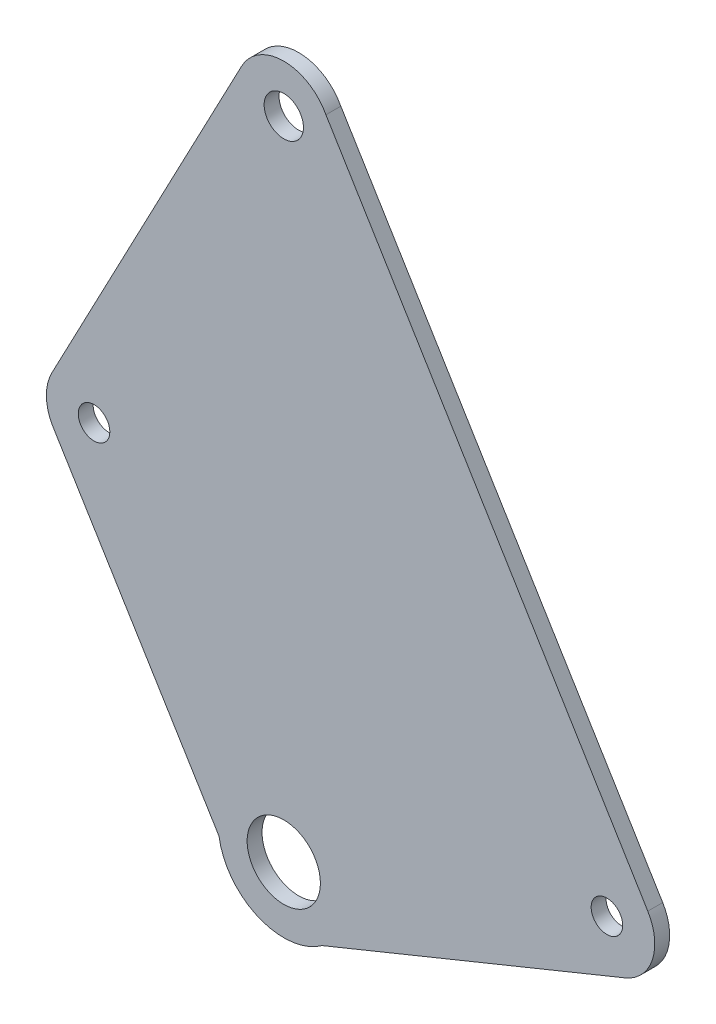
ISO-10303-21;
HEADER;
FILE_DESCRIPTION(('STEP AP214'),'2;1');
FILE_NAME('part.step','',(''),(''),'','','');
FILE_SCHEMA(('AUTOMOTIVE_DESIGN { 1 0 10303 214 1 1 1 1 }'));
ENDSEC;
DATA;
#1=APPLICATION_CONTEXT('core data for automotive mechanical design processes');
#2=APPLICATION_PROTOCOL_DEFINITION('international standard','automotive_design',2000,#1);
#3=PRODUCT_CONTEXT('',#1,'mechanical');
#4=PRODUCT('Part','Part','',(#3));
#5=PRODUCT_RELATED_PRODUCT_CATEGORY('part','',(#4));
#6=PRODUCT_DEFINITION_FORMATION('','',#4);
#7=PRODUCT_DEFINITION_CONTEXT('part definition',#1,'design');
#8=PRODUCT_DEFINITION('design','',#6,#7);
#9=PRODUCT_DEFINITION_SHAPE('','',#8);
#10=(LENGTH_UNIT() NAMED_UNIT(*) SI_UNIT(.MILLI.,.METRE.));
#11=(NAMED_UNIT(*) PLANE_ANGLE_UNIT() SI_UNIT($,.RADIAN.));
#12=(NAMED_UNIT(*) SI_UNIT($,.STERADIAN.) SOLID_ANGLE_UNIT());
#13=UNCERTAINTY_MEASURE_WITH_UNIT(LENGTH_MEASURE(1.E-05),#10,'distance_accuracy_value','');
#14=(GEOMETRIC_REPRESENTATION_CONTEXT(3) GLOBAL_UNCERTAINTY_ASSIGNED_CONTEXT((#13)) GLOBAL_UNIT_ASSIGNED_CONTEXT((#10,
#11,#12)) REPRESENTATION_CONTEXT('',''));
#15=CARTESIAN_POINT('',(0.,0.,0.));
#16=DIRECTION('',(0.,0.,1.));
#17=DIRECTION('',(1.,0.,0.));
#18=AXIS2_PLACEMENT_3D('',#15,#16,#17);
#19=CARTESIAN_POINT('',(0.,137.77468,3.175));
#20=DIRECTION('',(0.,0.,-1.));
#21=DIRECTION('',(-1.,0.,0.));
#22=AXIS2_PLACEMENT_3D('',#19,#20,#21);
#23=CYLINDRICAL_SURFACE('',#22,4.191);
#24=CARTESIAN_POINT('',(0.,137.77468,3.175));
#25=DIRECTION('',(0.,0.,1.));
#26=DIRECTION('',(1.,0.,0.));
#27=AXIS2_PLACEMENT_3D('',#24,#25,#26);
#28=CIRCLE('',#27,4.191);
#29=CARTESIAN_POINT('',(4.191,137.77468,3.175));
#30=VERTEX_POINT('',#29);
#31=EDGE_CURVE('E304',#30,#30,#28,.T.);
#32=ORIENTED_EDGE('',*,*,#31,.T.);
#33=EDGE_LOOP('',(#32));
#34=FACE_BOUND('',#33,.T.);
#35=CARTESIAN_POINT('',(0.,137.77468,0.));
#36=DIRECTION('',(0.,0.,1.));
#37=DIRECTION('',(1.,0.,0.));
#38=AXIS2_PLACEMENT_3D('',#35,#36,#37);
#39=CIRCLE('',#38,4.191);
#40=CARTESIAN_POINT('',(4.191,137.77468,0.));
#41=VERTEX_POINT('',#40);
#42=EDGE_CURVE('E347',#41,#41,#39,.T.);
#43=ORIENTED_EDGE('',*,*,#42,.F.);
#44=EDGE_LOOP('',(#43));
#45=FACE_BOUND('',#44,.T.);
#46=ADVANCED_FACE('F185',(#34,#45),#23,.F.);
#47=CARTESIAN_POINT('',(0.,0.,0.));
#48=DIRECTION('',(0.,0.,1.));
#49=DIRECTION('',(1.,0.,0.));
#50=AXIS2_PLACEMENT_3D('',#47,#48,#49);
#51=PLANE('',#50);
#52=DIRECTION('',(0.465795694600327,0.884892293384793,0.));
#53=VECTOR('',#52,1.);
#54=CARTESIAN_POINT('',(-65.7783383451263,34.6248543785204,0.));
#55=LINE('',#54,#53);
#56=CARTESIAN_POINT('',(-49.4532460993307,65.6383405153891,0.));
#57=VERTEX_POINT('',#56);
#58=CARTESIAN_POINT('',(-8.99050570078951,142.507164257139,0.));
#59=VERTEX_POINT('',#58);
#60=EDGE_CURVE('E315',#57,#59,#55,.T.);
#61=ORIENTED_EDGE('',*,*,#60,.T.);
#62=CARTESIAN_POINT('',(0.,137.77468,0.));
#63=DIRECTION('',(0.,0.,1.));
#64=DIRECTION('',(1.,0.,0.));
#65=AXIS2_PLACEMENT_3D('',#62,#63,#64);
#66=CIRCLE('',#65,10.16);
#67=CARTESIAN_POINT('',(8.99050570078949,142.507164257139,0.));
#68=VERTEX_POINT('',#67);
#69=EDGE_CURVE('E255',#59,#68,#66,.F.);
#70=ORIENTED_EDGE('',*,*,#69,.T.);
#71=DIRECTION('',(0.519997831961552,-0.854167580018866,0.));
#72=VECTOR('',#71,1.);
#73=CARTESIAN_POINT('',(69.8562291332203,42.5268864658639,0.));
#74=LINE('',#73,#72);
#75=CARTESIAN_POINT('',(77.628609890026,29.7596877316261,0.));
#76=VERTEX_POINT('',#75);
#77=EDGE_CURVE('E335',#68,#76,#74,.T.);
#78=ORIENTED_EDGE('',*,*,#77,.T.);
#79=CARTESIAN_POINT('',(68.9116019738283,24.4529712000593,0.));
#80=DIRECTION('',(0.,0.,1.));
#81=DIRECTION('',(1.,0.,0.));
#82=AXIS2_PLACEMENT_3D('',#79,#80,#81);
#83=CIRCLE('',#82,10.2052666480331);
#84=CARTESIAN_POINT('',(72.7640427233582,15.0027771476169,0.));
#85=VERTEX_POINT('',#84);
#86=EDGE_CURVE('E331',#76,#85,#83,.F.);
#87=ORIENTED_EDGE('',*,*,#86,.T.);
#88=DIRECTION('',(0.926011478030689,0.377495354349452,0.));
#89=VECTOR('',#88,1.);
#90=CARTESIAN_POINT('',(5.12462938834245,-12.5709245943874,0.));
#91=LINE('',#90,#89);
#92=CARTESIAN_POINT('',(8.17779026727476,-11.3262812230876,0.));
#93=VERTEX_POINT('',#92);
#94=EDGE_CURVE('E327',#93,#85,#91,.T.);
#95=ORIENTED_EDGE('',*,*,#94,.F.);
#96=CARTESIAN_POINT('',(0.,0.,0.));
#97=DIRECTION('',(0.,0.,1.));
#98=DIRECTION('',(1.,0.,0.));
#99=AXIS2_PLACEMENT_3D('',#96,#97,#98);
#100=CIRCLE('',#99,13.97);
#101=CARTESIAN_POINT('',(-13.808489627919,-2.11813932394753,0.));
#102=VERTEX_POINT('',#101);
#103=EDGE_CURVE('E208',#102,#93,#100,.T.);
#104=ORIENTED_EDGE('',*,*,#103,.F.);
#105=DIRECTION('',(-0.521686195121963,0.853137453063203,0.));
#106=VECTOR('',#105,1.);
#107=CARTESIAN_POINT('',(-10.993139947596,-6.7222102735182,0.));
#108=LINE('',#107,#106);
#109=CARTESIAN_POINT('',(-49.4532460993306,56.1733720011104,0.));
#110=VERTEX_POINT('',#109);
#111=EDGE_CURVE('E322',#102,#110,#108,.T.);
#112=ORIENTED_EDGE('',*,*,#111,.T.);
#113=CARTESIAN_POINT('',(-40.4627403985412,60.9058562582498,0.));
#114=DIRECTION('',(0.,0.,1.));
#115=DIRECTION('',(1.,0.,0.));
#116=AXIS2_PLACEMENT_3D('',#113,#114,#115);
#117=CIRCLE('',#116,10.16);
#118=EDGE_CURVE('E318',#110,#57,#117,.F.);
#119=ORIENTED_EDGE('',*,*,#118,.T.);
#120=EDGE_LOOP('',(#61,#70,#78,#87,#95,#104,#112,#119));
#121=FACE_BOUND('',#120,.T.);
#122=CARTESIAN_POINT('',(0.,0.,0.));
#123=DIRECTION('',(0.,0.,1.));
#124=DIRECTION('',(1.,0.,0.));
#125=AXIS2_PLACEMENT_3D('',#122,#123,#124);
#126=CIRCLE('',#125,7.8105);
#127=CARTESIAN_POINT('',(7.8105,0.,0.));
#128=VERTEX_POINT('',#127);
#129=EDGE_CURVE('E343',#128,#128,#126,.T.);
#130=ORIENTED_EDGE('',*,*,#129,.T.);
#131=EDGE_LOOP('',(#130));
#132=FACE_BOUND('',#131,.T.);
#133=ORIENTED_EDGE('',*,*,#42,.T.);
#134=EDGE_LOOP('',(#133));
#135=FACE_BOUND('',#134,.T.);
#136=CARTESIAN_POINT('',(68.9116019738283,24.4529712000593,0.));
#137=DIRECTION('',(0.,0.,1.));
#138=DIRECTION('',(1.,0.,0.));
#139=AXIS2_PLACEMENT_3D('',#136,#137,#138);
#140=CIRCLE('',#139,3.36549999999999);
#141=CARTESIAN_POINT('',(72.2771019738283,24.4529712000593,0.));
#142=VERTEX_POINT('',#141);
#143=EDGE_CURVE('E339',#142,#142,#140,.T.);
#144=ORIENTED_EDGE('',*,*,#143,.T.);
#145=EDGE_LOOP('',(#144));
#146=FACE_BOUND('',#145,.T.);
#147=CARTESIAN_POINT('',(-40.4627403985412,60.9058562582498,0.));
#148=DIRECTION('',(0.,0.,1.));
#149=DIRECTION('',(1.,0.,0.));
#150=AXIS2_PLACEMENT_3D('',#147,#148,#149);
#151=CIRCLE('',#150,3.36549999999999);
#152=CARTESIAN_POINT('',(-37.0972403985412,60.9058562582498,0.));
#153=VERTEX_POINT('',#152);
#154=EDGE_CURVE('E273',#153,#153,#151,.F.);
#155=ORIENTED_EDGE('',*,*,#154,.F.);
#156=EDGE_LOOP('',(#155));
#157=FACE_BOUND('',#156,.T.);
#158=ADVANCED_FACE('F374',(#121,#132,#135,#146,#157),#51,.F.);
#159=CARTESIAN_POINT('',(0.,0.,3.175));
#160=DIRECTION('',(0.,0.,-1.));
#161=DIRECTION('',(-1.,0.,0.));
#162=AXIS2_PLACEMENT_3D('',#159,#160,#161);
#163=CYLINDRICAL_SURFACE('',#162,7.8105);
#164=CARTESIAN_POINT('',(0.,0.,3.175));
#165=DIRECTION('',(0.,0.,1.));
#166=DIRECTION('',(1.,0.,0.));
#167=AXIS2_PLACEMENT_3D('',#164,#165,#166);
#168=CIRCLE('',#167,7.8105);
#169=CARTESIAN_POINT('',(7.8105,0.,3.175));
#170=VERTEX_POINT('',#169);
#171=EDGE_CURVE('E300',#170,#170,#168,.T.);
#172=ORIENTED_EDGE('',*,*,#171,.T.);
#173=EDGE_LOOP('',(#172));
#174=FACE_BOUND('',#173,.T.);
#175=ORIENTED_EDGE('',*,*,#129,.F.);
#176=EDGE_LOOP('',(#175));
#177=FACE_BOUND('',#176,.T.);
#178=ADVANCED_FACE('F402',(#174,#177),#163,.F.);
#179=CARTESIAN_POINT('',(0.,137.77468,3.175));
#180=DIRECTION('',(0.,0.,-1.));
#181=DIRECTION('',(-1.,0.,0.));
#182=AXIS2_PLACEMENT_3D('',#179,#180,#181);
#183=CYLINDRICAL_SURFACE('',#182,10.16);
#184=ORIENTED_EDGE('',*,*,#69,.F.);
#185=DIRECTION('',(0.,0.,-1.));
#186=VECTOR('',#185,1.);
#187=CARTESIAN_POINT('',(-8.99050570078951,142.507164257139,3.175));
#188=LINE('',#187,#186);
#189=CARTESIAN_POINT('',(-8.99050570078951,142.507164257139,3.175));
#190=VERTEX_POINT('',#189);
#191=EDGE_CURVE('E194',#190,#59,#188,.T.);
#192=ORIENTED_EDGE('',*,*,#191,.F.);
#193=CARTESIAN_POINT('',(0.,137.77468,3.175));
#194=DIRECTION('',(0.,0.,1.));
#195=DIRECTION('',(1.,0.,0.));
#196=AXIS2_PLACEMENT_3D('',#193,#194,#195);
#197=CIRCLE('',#196,10.16);
#198=CARTESIAN_POINT('',(8.99050570078949,142.507164257139,3.175));
#199=VERTEX_POINT('',#198);
#200=EDGE_CURVE('E252',#190,#199,#197,.F.);
#201=ORIENTED_EDGE('',*,*,#200,.T.);
#202=DIRECTION('',(0.,0.,-1.));
#203=VECTOR('',#202,1.);
#204=CARTESIAN_POINT('',(8.99050570078949,142.507164257139,3.175));
#205=LINE('',#204,#203);
#206=EDGE_CURVE('E312',#199,#68,#205,.T.);
#207=ORIENTED_EDGE('',*,*,#206,.T.);
#208=EDGE_LOOP('',(#184,#192,#201,#207));
#209=FACE_BOUND('',#208,.T.);
#210=ADVANCED_FACE('F187',(#209),#183,.T.);
#211=CARTESIAN_POINT('',(0.,0.,3.175));
#212=DIRECTION('',(0.,0.,-1.));
#213=DIRECTION('',(-1.,0.,0.));
#214=AXIS2_PLACEMENT_3D('',#211,#212,#213);
#215=CYLINDRICAL_SURFACE('',#214,13.97);
#216=ORIENTED_EDGE('',*,*,#103,.T.);
#217=DIRECTION('',(0.,0.,-1.));
#218=VECTOR('',#217,1.);
#219=CARTESIAN_POINT('',(8.17779026727476,-11.3262812230876,3.175));
#220=LINE('',#219,#218);
#221=CARTESIAN_POINT('',(8.17779026727476,-11.3262812230876,3.175));
#222=VERTEX_POINT('',#221);
#223=EDGE_CURVE('E362',#222,#93,#220,.T.);
#224=ORIENTED_EDGE('',*,*,#223,.F.);
#225=CARTESIAN_POINT('',(0.,0.,3.175));
#226=DIRECTION('',(0.,0.,1.));
#227=DIRECTION('',(1.,0.,0.));
#228=AXIS2_PLACEMENT_3D('',#225,#226,#227);
#229=CIRCLE('',#228,13.97);
#230=CARTESIAN_POINT('',(-13.808489627919,-2.11813932394753,3.175));
#231=VERTEX_POINT('',#230);
#232=EDGE_CURVE('E201',#231,#222,#229,.T.);
#233=ORIENTED_EDGE('',*,*,#232,.F.);
#234=DIRECTION('',(0.,0.,-1.));
#235=VECTOR('',#234,1.);
#236=CARTESIAN_POINT('',(-13.808489627919,-2.11813932394753,3.175));
#237=LINE('',#236,#235);
#238=EDGE_CURVE('E12',#102,#231,#237,.F.);
#239=ORIENTED_EDGE('',*,*,#238,.F.);
#240=EDGE_LOOP('',(#216,#224,#233,#239));
#241=FACE_BOUND('',#240,.T.);
#242=ADVANCED_FACE('F399',(#241),#215,.T.);
#243=CARTESIAN_POINT('',(0.,0.,3.175));
#244=DIRECTION('',(0.,0.,1.));
#245=DIRECTION('',(1.,0.,0.));
#246=AXIS2_PLACEMENT_3D('',#243,#244,#245);
#247=PLANE('',#246);
#248=ORIENTED_EDGE('',*,*,#200,.F.);
#249=DIRECTION('',(0.465795694600327,0.884892293384793,0.));
#250=VECTOR('',#249,1.);
#251=CARTESIAN_POINT('',(-65.7783383451263,34.6248543785204,3.175));
#252=LINE('',#251,#250);
#253=CARTESIAN_POINT('',(-49.4532460993307,65.6383405153891,3.175));
#254=VERTEX_POINT('',#253);
#255=EDGE_CURVE('E267',#254,#190,#252,.T.);
#256=ORIENTED_EDGE('',*,*,#255,.F.);
#257=CARTESIAN_POINT('',(-40.4627403985412,60.9058562582498,3.175));
#258=DIRECTION('',(0.,0.,1.));
#259=DIRECTION('',(1.,0.,0.));
#260=AXIS2_PLACEMENT_3D('',#257,#258,#259);
#261=CIRCLE('',#260,10.16);
#262=CARTESIAN_POINT('',(-49.4532460993306,56.1733720011104,3.175));
#263=VERTEX_POINT('',#262);
#264=EDGE_CURVE('E277',#263,#254,#261,.F.);
#265=ORIENTED_EDGE('',*,*,#264,.F.);
#266=DIRECTION('',(-0.521686195121963,0.853137453063203,0.));
#267=VECTOR('',#266,1.);
#268=CARTESIAN_POINT('',(-10.993139947596,-6.7222102735182,3.175));
#269=LINE('',#268,#267);
#270=EDGE_CURVE('E280',#231,#263,#269,.T.);
#271=ORIENTED_EDGE('',*,*,#270,.F.);
#272=ORIENTED_EDGE('',*,*,#232,.T.);
#273=DIRECTION('',(0.926011478030689,0.377495354349452,0.));
#274=VECTOR('',#273,1.);
#275=CARTESIAN_POINT('',(5.12462938834245,-12.5709245943874,3.175));
#276=LINE('',#275,#274);
#277=CARTESIAN_POINT('',(72.7640427233582,15.0027771476169,3.175));
#278=VERTEX_POINT('',#277);
#279=EDGE_CURVE('E287',#222,#278,#276,.T.);
#280=ORIENTED_EDGE('',*,*,#279,.T.);
#281=CARTESIAN_POINT('',(68.9116019738283,24.4529712000593,3.175));
#282=DIRECTION('',(0.,0.,1.));
#283=DIRECTION('',(1.,0.,0.));
#284=AXIS2_PLACEMENT_3D('',#281,#282,#283);
#285=CIRCLE('',#284,10.2052666480331);
#286=CARTESIAN_POINT('',(77.628609890026,29.7596877316261,3.175));
#287=VERTEX_POINT('',#286);
#288=EDGE_CURVE('E290',#287,#278,#285,.F.);
#289=ORIENTED_EDGE('',*,*,#288,.F.);
#290=DIRECTION('',(0.519997831961552,-0.854167580018866,0.));
#291=VECTOR('',#290,1.);
#292=CARTESIAN_POINT('',(69.8562291332203,42.5268864658639,3.175));
#293=LINE('',#292,#291);
#294=EDGE_CURVE('E271',#199,#287,#293,.T.);
#295=ORIENTED_EDGE('',*,*,#294,.F.);
#296=EDGE_LOOP('',(#248,#256,#265,#271,#272,#280,#289,#295));
#297=FACE_BOUND('',#296,.T.);
#298=ORIENTED_EDGE('',*,*,#171,.F.);
#299=EDGE_LOOP('',(#298));
#300=FACE_BOUND('',#299,.T.);
#301=ORIENTED_EDGE('',*,*,#31,.F.);
#302=EDGE_LOOP('',(#301));
#303=FACE_BOUND('',#302,.T.);
#304=CARTESIAN_POINT('',(68.9116019738283,24.4529712000593,3.175));
#305=DIRECTION('',(0.,0.,1.));
#306=DIRECTION('',(1.,0.,0.));
#307=AXIS2_PLACEMENT_3D('',#304,#305,#306);
#308=CIRCLE('',#307,3.36549999999999);
#309=CARTESIAN_POINT('',(72.2771019738283,24.4529712000593,3.175));
#310=VERTEX_POINT('',#309);
#311=EDGE_CURVE('E296',#310,#310,#308,.T.);
#312=ORIENTED_EDGE('',*,*,#311,.F.);
#313=EDGE_LOOP('',(#312));
#314=FACE_BOUND('',#313,.T.);
#315=CARTESIAN_POINT('',(-40.4627403985412,60.9058562582498,3.175));
#316=DIRECTION('',(0.,0.,1.));
#317=DIRECTION('',(1.,0.,0.));
#318=AXIS2_PLACEMENT_3D('',#315,#316,#317);
#319=CIRCLE('',#318,3.36549999999999);
#320=CARTESIAN_POINT('',(-37.0972403985412,60.9058562582498,3.175));
#321=VERTEX_POINT('',#320);
#322=EDGE_CURVE('E308',#321,#321,#319,.F.);
#323=ORIENTED_EDGE('',*,*,#322,.T.);
#324=EDGE_LOOP('',(#323));
#325=FACE_BOUND('',#324,.T.);
#326=ADVANCED_FACE('F264',(#297,#300,#303,#314,#325),#247,.T.);
#327=CARTESIAN_POINT('',(-65.7783383451263,34.6248543785204,3.175));
#328=DIRECTION('',(-0.884892293384793,0.465795694600327,0.));
#329=DIRECTION('',(-0.465795694600327,-0.884892293384793,0.));
#330=AXIS2_PLACEMENT_3D('',#327,#328,#329);
#331=PLANE('',#330);
#332=ORIENTED_EDGE('',*,*,#60,.F.);
#333=DIRECTION('',(0.,0.,-1.));
#334=VECTOR('',#333,1.);
#335=CARTESIAN_POINT('',(-49.4532460993307,65.6383405153891,3.175));
#336=LINE('',#335,#334);
#337=EDGE_CURVE('E261',#254,#57,#336,.T.);
#338=ORIENTED_EDGE('',*,*,#337,.F.);
#339=ORIENTED_EDGE('',*,*,#255,.T.);
#340=ORIENTED_EDGE('',*,*,#191,.T.);
#341=EDGE_LOOP('',(#332,#338,#339,#340));
#342=FACE_BOUND('',#341,.T.);
#343=ADVANCED_FACE('F275',(#342),#331,.T.);
#344=CARTESIAN_POINT('',(-40.4627403985412,60.9058562582498,3.175));
#345=DIRECTION('',(0.,0.,-1.));
#346=DIRECTION('',(-1.,0.,0.));
#347=AXIS2_PLACEMENT_3D('',#344,#345,#346);
#348=CYLINDRICAL_SURFACE('',#347,10.16);
#349=ORIENTED_EDGE('',*,*,#118,.F.);
#350=DIRECTION('',(0.,0.,-1.));
#351=VECTOR('',#350,1.);
#352=CARTESIAN_POINT('',(-49.4532460993306,56.1733720011104,3.175));
#353=LINE('',#352,#351);
#354=EDGE_CURVE('E365',#263,#110,#353,.T.);
#355=ORIENTED_EDGE('',*,*,#354,.F.);
#356=ORIENTED_EDGE('',*,*,#264,.T.);
#357=ORIENTED_EDGE('',*,*,#337,.T.);
#358=EDGE_LOOP('',(#349,#355,#356,#357));
#359=FACE_BOUND('',#358,.T.);
#360=ADVANCED_FACE('F372',(#359),#348,.T.);
#361=CARTESIAN_POINT('',(-10.993139947596,-6.7222102735182,3.175));
#362=DIRECTION('',(-0.853137453063203,-0.521686195121963,0.));
#363=DIRECTION('',(0.521686195121963,-0.853137453063203,0.));
#364=AXIS2_PLACEMENT_3D('',#361,#362,#363);
#365=PLANE('',#364);
#366=ORIENTED_EDGE('',*,*,#111,.F.);
#367=ORIENTED_EDGE('',*,*,#238,.T.);
#368=ORIENTED_EDGE('',*,*,#270,.T.);
#369=ORIENTED_EDGE('',*,*,#354,.T.);
#370=EDGE_LOOP('',(#366,#367,#368,#369));
#371=FACE_BOUND('',#370,.T.);
#372=ADVANCED_FACE('F378',(#371),#365,.T.);
#373=CARTESIAN_POINT('',(-40.4627403985412,60.9058562582498,3.175));
#374=DIRECTION('',(0.,0.,-1.));
#375=DIRECTION('',(-1.,0.,0.));
#376=AXIS2_PLACEMENT_3D('',#373,#374,#375);
#377=CYLINDRICAL_SURFACE('',#376,3.36549999999999);
#378=ORIENTED_EDGE('',*,*,#322,.F.);
#379=EDGE_LOOP('',(#378));
#380=FACE_BOUND('',#379,.T.);
#381=ORIENTED_EDGE('',*,*,#154,.T.);
#382=EDGE_LOOP('',(#381));
#383=FACE_BOUND('',#382,.T.);
#384=ADVANCED_FACE('F414',(#380,#383),#377,.F.);
#385=CARTESIAN_POINT('',(5.12462938834245,-12.5709245943874,3.175));
#386=DIRECTION('',(-0.377495354349452,0.926011478030689,0.));
#387=DIRECTION('',(-0.926011478030689,-0.377495354349452,0.));
#388=AXIS2_PLACEMENT_3D('',#385,#386,#387);
#389=PLANE('',#388);
#390=ORIENTED_EDGE('',*,*,#94,.T.);
#391=DIRECTION('',(0.,0.,-1.));
#392=VECTOR('',#391,1.);
#393=CARTESIAN_POINT('',(72.7640427233582,15.0027771476169,3.175));
#394=LINE('',#393,#392);
#395=EDGE_CURVE('E359',#278,#85,#394,.T.);
#396=ORIENTED_EDGE('',*,*,#395,.F.);
#397=ORIENTED_EDGE('',*,*,#279,.F.);
#398=ORIENTED_EDGE('',*,*,#223,.T.);
#399=EDGE_LOOP('',(#390,#396,#397,#398));
#400=FACE_BOUND('',#399,.T.);
#401=ADVANCED_FACE('F383',(#400),#389,.F.);
#402=CARTESIAN_POINT('',(68.9116019738283,24.4529712000593,3.175));
#403=DIRECTION('',(0.,0.,-1.));
#404=DIRECTION('',(-1.,0.,0.));
#405=AXIS2_PLACEMENT_3D('',#402,#403,#404);
#406=CYLINDRICAL_SURFACE('',#405,10.2052666480331);
#407=ORIENTED_EDGE('',*,*,#86,.F.);
#408=DIRECTION('',(0.,0.,-1.));
#409=VECTOR('',#408,1.);
#410=CARTESIAN_POINT('',(77.628609890026,29.7596877316261,3.175));
#411=LINE('',#410,#409);
#412=EDGE_CURVE('E356',#287,#76,#411,.T.);
#413=ORIENTED_EDGE('',*,*,#412,.F.);
#414=ORIENTED_EDGE('',*,*,#288,.T.);
#415=ORIENTED_EDGE('',*,*,#395,.T.);
#416=EDGE_LOOP('',(#407,#413,#414,#415));
#417=FACE_BOUND('',#416,.T.);
#418=ADVANCED_FACE('F386',(#417),#406,.T.);
#419=CARTESIAN_POINT('',(69.8562291332203,42.5268864658639,3.175));
#420=DIRECTION('',(0.854167580018866,0.519997831961552,0.));
#421=DIRECTION('',(-0.519997831961552,0.854167580018866,0.));
#422=AXIS2_PLACEMENT_3D('',#419,#420,#421);
#423=PLANE('',#422);
#424=ORIENTED_EDGE('',*,*,#77,.F.);
#425=ORIENTED_EDGE('',*,*,#206,.F.);
#426=ORIENTED_EDGE('',*,*,#294,.T.);
#427=ORIENTED_EDGE('',*,*,#412,.T.);
#428=EDGE_LOOP('',(#424,#425,#426,#427));
#429=FACE_BOUND('',#428,.T.);
#430=ADVANCED_FACE('F389',(#429),#423,.T.);
#431=CARTESIAN_POINT('',(68.9116019738283,24.4529712000593,3.175));
#432=DIRECTION('',(0.,0.,-1.));
#433=DIRECTION('',(-1.,0.,0.));
#434=AXIS2_PLACEMENT_3D('',#431,#432,#433);
#435=CYLINDRICAL_SURFACE('',#434,3.36549999999999);
#436=ORIENTED_EDGE('',*,*,#311,.T.);
#437=EDGE_LOOP('',(#436));
#438=FACE_BOUND('',#437,.T.);
#439=ORIENTED_EDGE('',*,*,#143,.F.);
#440=EDGE_LOOP('',(#439));
#441=FACE_BOUND('',#440,.T.);
#442=ADVANCED_FACE('F391',(#438,#441),#435,.F.);
#443=CLOSED_SHELL('',(#46,#158,#178,#210,#242,#326,#343,#360,#372,#384,#401,#418,#430,#442));
#444=MANIFOLD_SOLID_BREP('B2',#443);
#445=ADVANCED_BREP_SHAPE_REPRESENTATION('',(#18,#444),#14);
#446=SHAPE_DEFINITION_REPRESENTATION(#9,#445);
ENDSEC;
END-ISO-10303-21;
